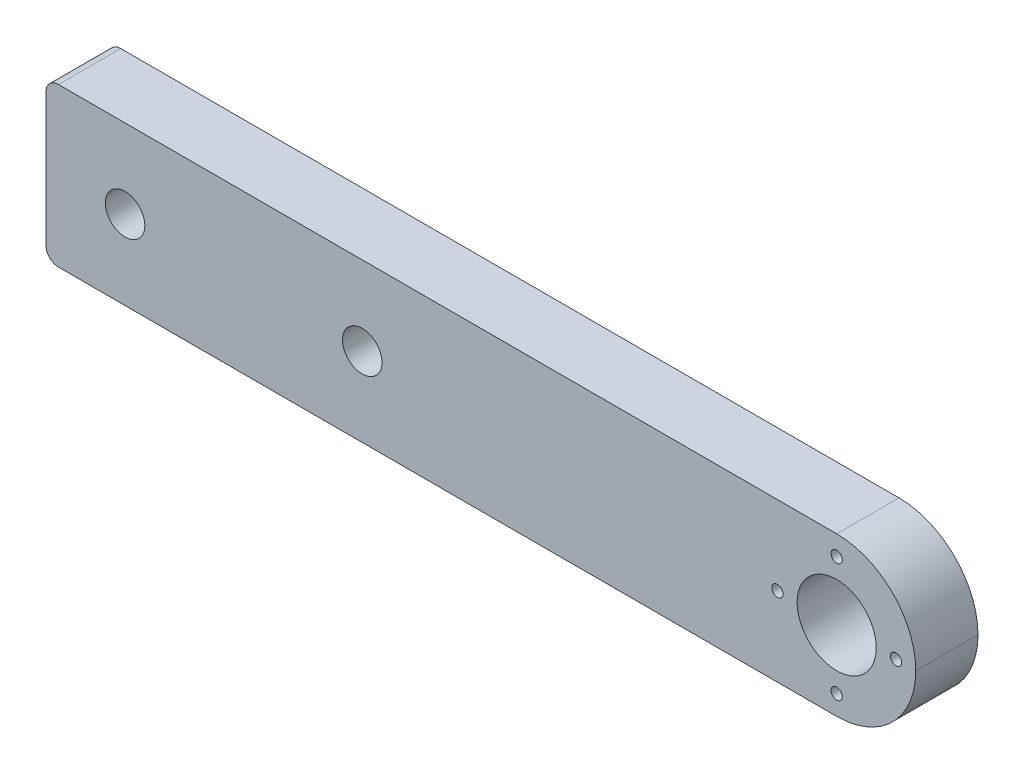
ISO-10303-21;
HEADER;
FILE_DESCRIPTION(('STEP AP214'),'2;1');
FILE_NAME('part.step','',(''),(''),'','','');
FILE_SCHEMA(('AUTOMOTIVE_DESIGN { 1 0 10303 214 1 1 1 1 }'));
ENDSEC;
DATA;
#1=APPLICATION_CONTEXT('core data for automotive mechanical design processes');
#2=APPLICATION_PROTOCOL_DEFINITION('international standard','automotive_design',2000,#1);
#3=PRODUCT_CONTEXT('',#1,'mechanical');
#4=PRODUCT('Part','Part','',(#3));
#5=PRODUCT_RELATED_PRODUCT_CATEGORY('part','',(#4));
#6=PRODUCT_DEFINITION_FORMATION('','',#4);
#7=PRODUCT_DEFINITION_CONTEXT('part definition',#1,'design');
#8=PRODUCT_DEFINITION('design','',#6,#7);
#9=PRODUCT_DEFINITION_SHAPE('','',#8);
#10=(LENGTH_UNIT() NAMED_UNIT(*) SI_UNIT(.MILLI.,.METRE.));
#11=(NAMED_UNIT(*) PLANE_ANGLE_UNIT() SI_UNIT($,.RADIAN.));
#12=(NAMED_UNIT(*) SI_UNIT($,.STERADIAN.) SOLID_ANGLE_UNIT());
#13=UNCERTAINTY_MEASURE_WITH_UNIT(LENGTH_MEASURE(1.E-05),#10,'distance_accuracy_value','');
#14=(GEOMETRIC_REPRESENTATION_CONTEXT(3) GLOBAL_UNCERTAINTY_ASSIGNED_CONTEXT((#13)) GLOBAL_UNIT_ASSIGNED_CONTEXT((#10,
#11,#12)) REPRESENTATION_CONTEXT('',''));
#15=CARTESIAN_POINT('',(0.,0.,0.));
#16=DIRECTION('',(0.,0.,1.));
#17=DIRECTION('',(1.,0.,0.));
#18=AXIS2_PLACEMENT_3D('',#15,#16,#17);
#19=CARTESIAN_POINT('',(0.,0.,10.));
#20=DIRECTION('',(0.,0.,-1.));
#21=DIRECTION('',(-1.,0.,0.));
#22=AXIS2_PLACEMENT_3D('',#19,#20,#21);
#23=PLANE('',#22);
#24=CARTESIAN_POINT('',(63.5,0.,10.));
#25=DIRECTION('',(0.,0.,-1.));
#26=DIRECTION('',(-1.,0.,0.));
#27=AXIS2_PLACEMENT_3D('',#24,#25,#26);
#28=CIRCLE('',#27,12.7);
#29=CARTESIAN_POINT('',(63.5,-12.7,10.));
#30=VERTEX_POINT('',#29);
#31=CARTESIAN_POINT('',(76.2,0.,10.));
#32=VERTEX_POINT('',#31);
#33=EDGE_CURVE('E49',#30,#32,#28,.F.);
#34=ORIENTED_EDGE('',*,*,#33,.T.);
#35=CARTESIAN_POINT('',(63.5,0.,10.));
#36=DIRECTION('',(0.,0.,-1.));
#37=DIRECTION('',(-1.,0.,0.));
#38=AXIS2_PLACEMENT_3D('',#35,#36,#37);
#39=CIRCLE('',#38,12.7);
#40=CARTESIAN_POINT('',(63.5,12.7,10.));
#41=VERTEX_POINT('',#40);
#42=EDGE_CURVE('E42',#32,#41,#39,.F.);
#43=ORIENTED_EDGE('',*,*,#42,.T.);
#44=DIRECTION('',(-1.,0.,0.));
#45=VECTOR('',#44,1.);
#46=CARTESIAN_POINT('',(76.2,12.7,10.));
#47=LINE('',#46,#45);
#48=CARTESIAN_POINT('',(-61.5,12.7,10.));
#49=VERTEX_POINT('',#48);
#50=EDGE_CURVE('E115',#41,#49,#47,.T.);
#51=ORIENTED_EDGE('',*,*,#50,.T.);
#52=CARTESIAN_POINT('',(-61.5,10.7,10.));
#53=DIRECTION('',(0.,0.,-1.));
#54=DIRECTION('',(-1.,0.,0.));
#55=AXIS2_PLACEMENT_3D('',#52,#53,#54);
#56=CIRCLE('',#55,2.);
#57=CARTESIAN_POINT('',(-63.5,10.7,10.));
#58=VERTEX_POINT('',#57);
#59=EDGE_CURVE('E129',#49,#58,#56,.F.);
#60=ORIENTED_EDGE('',*,*,#59,.T.);
#61=DIRECTION('',(0.,-1.,0.));
#62=VECTOR('',#61,1.);
#63=CARTESIAN_POINT('',(-63.5,-12.7,10.));
#64=LINE('',#63,#62);
#65=CARTESIAN_POINT('',(-63.5,-10.7,10.));
#66=VERTEX_POINT('',#65);
#67=EDGE_CURVE('E118',#58,#66,#64,.T.);
#68=ORIENTED_EDGE('',*,*,#67,.T.);
#69=CARTESIAN_POINT('',(-61.5,-10.7,10.));
#70=DIRECTION('',(0.,0.,-1.));
#71=DIRECTION('',(-1.,0.,0.));
#72=AXIS2_PLACEMENT_3D('',#69,#70,#71);
#73=CIRCLE('',#72,2.);
#74=CARTESIAN_POINT('',(-61.5,-12.7,10.));
#75=VERTEX_POINT('',#74);
#76=EDGE_CURVE('E131',#66,#75,#73,.F.);
#77=ORIENTED_EDGE('',*,*,#76,.T.);
#78=DIRECTION('',(1.,0.,0.));
#79=VECTOR('',#78,1.);
#80=CARTESIAN_POINT('',(63.5,-12.7,10.));
#81=LINE('',#80,#79);
#82=EDGE_CURVE('E108',#75,#30,#81,.T.);
#83=ORIENTED_EDGE('',*,*,#82,.T.);
#84=EDGE_LOOP('',(#34,#43,#51,#60,#68,#77,#83));
#85=FACE_BOUND('',#84,.T.);
#86=CARTESIAN_POINT('',(-50.8,0.,10.));
#87=DIRECTION('',(0.,0.,1.));
#88=DIRECTION('',(1.,0.,0.));
#89=AXIS2_PLACEMENT_3D('',#86,#87,#88);
#90=CIRCLE('',#89,3.175);
#91=CARTESIAN_POINT('',(-47.625,0.,10.));
#92=VERTEX_POINT('',#91);
#93=EDGE_CURVE('E195',#92,#92,#90,.T.);
#94=ORIENTED_EDGE('',*,*,#93,.F.);
#95=EDGE_LOOP('',(#94));
#96=FACE_BOUND('',#95,.T.);
#97=CARTESIAN_POINT('',(63.5,9.52500000000001,10.));
#98=DIRECTION('',(0.,0.,1.));
#99=DIRECTION('',(1.,0.,0.));
#100=AXIS2_PLACEMENT_3D('',#97,#98,#99);
#101=CIRCLE('',#100,0.900000000000004);
#102=CARTESIAN_POINT('',(64.4,9.52500000000001,10.));
#103=VERTEX_POINT('',#102);
#104=EDGE_CURVE('E189',#103,#103,#101,.T.);
#105=ORIENTED_EDGE('',*,*,#104,.F.);
#106=EDGE_LOOP('',(#105));
#107=FACE_BOUND('',#106,.T.);
#108=CARTESIAN_POINT('',(63.5,0.,10.));
#109=DIRECTION('',(0.,0.,1.));
#110=DIRECTION('',(1.,0.,0.));
#111=AXIS2_PLACEMENT_3D('',#108,#109,#110);
#112=CIRCLE('',#111,6.35);
#113=CARTESIAN_POINT('',(69.85,0.,10.));
#114=VERTEX_POINT('',#113);
#115=EDGE_CURVE('E183',#114,#114,#112,.T.);
#116=ORIENTED_EDGE('',*,*,#115,.F.);
#117=EDGE_LOOP('',(#116));
#118=FACE_BOUND('',#117,.T.);
#119=CARTESIAN_POINT('',(63.5,-9.52499999999999,10.));
#120=DIRECTION('',(0.,0.,1.));
#121=DIRECTION('',(1.,0.,0.));
#122=AXIS2_PLACEMENT_3D('',#119,#120,#121);
#123=CIRCLE('',#122,0.900000000000004);
#124=CARTESIAN_POINT('',(64.4,-9.52499999999999,10.));
#125=VERTEX_POINT('',#124);
#126=EDGE_CURVE('E177',#125,#125,#123,.T.);
#127=ORIENTED_EDGE('',*,*,#126,.F.);
#128=EDGE_LOOP('',(#127));
#129=FACE_BOUND('',#128,.T.);
#130=CARTESIAN_POINT('',(53.975,0.,10.));
#131=DIRECTION('',(0.,0.,1.));
#132=DIRECTION('',(1.,0.,0.));
#133=AXIS2_PLACEMENT_3D('',#130,#131,#132);
#134=CIRCLE('',#133,0.900000000000004);
#135=CARTESIAN_POINT('',(54.875,0.,10.));
#136=VERTEX_POINT('',#135);
#137=EDGE_CURVE('E171',#136,#136,#134,.T.);
#138=ORIENTED_EDGE('',*,*,#137,.F.);
#139=EDGE_LOOP('',(#138));
#140=FACE_BOUND('',#139,.T.);
#141=CARTESIAN_POINT('',(73.025,0.,10.));
#142=DIRECTION('',(0.,0.,1.));
#143=DIRECTION('',(1.,0.,0.));
#144=AXIS2_PLACEMENT_3D('',#141,#142,#143);
#145=CIRCLE('',#144,0.900000000000003);
#146=CARTESIAN_POINT('',(73.925,0.,10.));
#147=VERTEX_POINT('',#146);
#148=EDGE_CURVE('E165',#147,#147,#145,.T.);
#149=ORIENTED_EDGE('',*,*,#148,.F.);
#150=EDGE_LOOP('',(#149));
#151=FACE_BOUND('',#150,.T.);
#152=CARTESIAN_POINT('',(-12.7,0.,10.));
#153=DIRECTION('',(0.,0.,1.));
#154=DIRECTION('',(1.,0.,0.));
#155=AXIS2_PLACEMENT_3D('',#152,#153,#154);
#156=CIRCLE('',#155,3.175);
#157=CARTESIAN_POINT('',(-9.52499999999998,0.,10.));
#158=VERTEX_POINT('',#157);
#159=EDGE_CURVE('E157',#158,#158,#156,.T.);
#160=ORIENTED_EDGE('',*,*,#159,.F.);
#161=EDGE_LOOP('',(#160));
#162=FACE_BOUND('',#161,.T.);
#163=ADVANCED_FACE('F33',(#85,#96,#107,#118,#129,#140,#151,#162),#23,.F.);
#164=CARTESIAN_POINT('',(0.,0.,0.));
#165=DIRECTION('',(0.,0.,-1.));
#166=DIRECTION('',(-1.,0.,0.));
#167=AXIS2_PLACEMENT_3D('',#164,#165,#166);
#168=PLANE('',#167);
#169=CARTESIAN_POINT('',(73.025,0.,0.));
#170=DIRECTION('',(0.,0.,1.));
#171=DIRECTION('',(1.,0.,0.));
#172=AXIS2_PLACEMENT_3D('',#169,#170,#171);
#173=CIRCLE('',#172,0.900000000000003);
#174=CARTESIAN_POINT('',(73.925,0.,0.));
#175=VERTEX_POINT('',#174);
#176=EDGE_CURVE('E162',#175,#175,#173,.T.);
#177=ORIENTED_EDGE('',*,*,#176,.T.);
#178=EDGE_LOOP('',(#177));
#179=FACE_BOUND('',#178,.T.);
#180=CARTESIAN_POINT('',(63.5,-9.52499999999999,0.));
#181=DIRECTION('',(0.,0.,1.));
#182=DIRECTION('',(1.,0.,0.));
#183=AXIS2_PLACEMENT_3D('',#180,#181,#182);
#184=CIRCLE('',#183,0.900000000000004);
#185=CARTESIAN_POINT('',(64.4,-9.52499999999999,0.));
#186=VERTEX_POINT('',#185);
#187=EDGE_CURVE('E174',#186,#186,#184,.T.);
#188=ORIENTED_EDGE('',*,*,#187,.T.);
#189=EDGE_LOOP('',(#188));
#190=FACE_BOUND('',#189,.T.);
#191=CARTESIAN_POINT('',(63.5,9.52500000000001,0.));
#192=DIRECTION('',(0.,0.,1.));
#193=DIRECTION('',(1.,0.,0.));
#194=AXIS2_PLACEMENT_3D('',#191,#192,#193);
#195=CIRCLE('',#194,0.900000000000004);
#196=CARTESIAN_POINT('',(64.4,9.52500000000001,0.));
#197=VERTEX_POINT('',#196);
#198=EDGE_CURVE('E186',#197,#197,#195,.T.);
#199=ORIENTED_EDGE('',*,*,#198,.T.);
#200=EDGE_LOOP('',(#199));
#201=FACE_BOUND('',#200,.T.);
#202=DIRECTION('',(-1.,0.,0.));
#203=VECTOR('',#202,1.);
#204=CARTESIAN_POINT('',(63.5,12.7,0.));
#205=LINE('',#204,#203);
#206=CARTESIAN_POINT('',(63.5,12.7,0.));
#207=VERTEX_POINT('',#206);
#208=CARTESIAN_POINT('',(-61.5,12.7,0.));
#209=VERTEX_POINT('',#208);
#210=EDGE_CURVE('E120',#207,#209,#205,.T.);
#211=ORIENTED_EDGE('',*,*,#210,.F.);
#212=CARTESIAN_POINT('',(63.5,0.,0.));
#213=DIRECTION('',(0.,0.,-1.));
#214=DIRECTION('',(-1.,0.,0.));
#215=AXIS2_PLACEMENT_3D('',#212,#213,#214);
#216=CIRCLE('',#215,12.7);
#217=CARTESIAN_POINT('',(76.2,0.,0.));
#218=VERTEX_POINT('',#217);
#219=EDGE_CURVE('E140',#207,#218,#216,.T.);
#220=ORIENTED_EDGE('',*,*,#219,.T.);
#221=CARTESIAN_POINT('',(63.5,0.,0.));
#222=DIRECTION('',(0.,0.,-1.));
#223=DIRECTION('',(-1.,0.,0.));
#224=AXIS2_PLACEMENT_3D('',#221,#222,#223);
#225=CIRCLE('',#224,12.7);
#226=CARTESIAN_POINT('',(63.5,-12.7,0.));
#227=VERTEX_POINT('',#226);
#228=EDGE_CURVE('E114',#218,#227,#225,.T.);
#229=ORIENTED_EDGE('',*,*,#228,.T.);
#230=DIRECTION('',(1.,0.,0.));
#231=VECTOR('',#230,1.);
#232=CARTESIAN_POINT('',(63.5,-12.7,0.));
#233=LINE('',#232,#231);
#234=CARTESIAN_POINT('',(-61.5,-12.7,0.));
#235=VERTEX_POINT('',#234);
#236=EDGE_CURVE('E107',#235,#227,#233,.T.);
#237=ORIENTED_EDGE('',*,*,#236,.F.);
#238=CARTESIAN_POINT('',(-61.5,-10.7,0.));
#239=DIRECTION('',(0.,0.,-1.));
#240=DIRECTION('',(-1.,0.,0.));
#241=AXIS2_PLACEMENT_3D('',#238,#239,#240);
#242=CIRCLE('',#241,2.);
#243=CARTESIAN_POINT('',(-63.5,-10.7,0.));
#244=VERTEX_POINT('',#243);
#245=EDGE_CURVE('E93',#235,#244,#242,.T.);
#246=ORIENTED_EDGE('',*,*,#245,.T.);
#247=DIRECTION('',(0.,-1.,0.));
#248=VECTOR('',#247,1.);
#249=CARTESIAN_POINT('',(-63.5,-12.7,0.));
#250=LINE('',#249,#248);
#251=CARTESIAN_POINT('',(-63.5,10.7,0.));
#252=VERTEX_POINT('',#251);
#253=EDGE_CURVE('E116',#252,#244,#250,.T.);
#254=ORIENTED_EDGE('',*,*,#253,.F.);
#255=CARTESIAN_POINT('',(-61.5,10.7,0.));
#256=DIRECTION('',(0.,0.,-1.));
#257=DIRECTION('',(-1.,0.,0.));
#258=AXIS2_PLACEMENT_3D('',#255,#256,#257);
#259=CIRCLE('',#258,2.);
#260=EDGE_CURVE('E104',#252,#209,#259,.T.);
#261=ORIENTED_EDGE('',*,*,#260,.T.);
#262=EDGE_LOOP('',(#211,#220,#229,#237,#246,#254,#261));
#263=FACE_BOUND('',#262,.T.);
#264=CARTESIAN_POINT('',(-50.8,0.,0.));
#265=DIRECTION('',(0.,0.,1.));
#266=DIRECTION('',(1.,0.,0.));
#267=AXIS2_PLACEMENT_3D('',#264,#265,#266);
#268=CIRCLE('',#267,3.175);
#269=CARTESIAN_POINT('',(-47.625,0.,0.));
#270=VERTEX_POINT('',#269);
#271=EDGE_CURVE('E192',#270,#270,#268,.T.);
#272=ORIENTED_EDGE('',*,*,#271,.T.);
#273=EDGE_LOOP('',(#272));
#274=FACE_BOUND('',#273,.T.);
#275=CARTESIAN_POINT('',(63.5,0.,0.));
#276=DIRECTION('',(0.,0.,1.));
#277=DIRECTION('',(1.,0.,0.));
#278=AXIS2_PLACEMENT_3D('',#275,#276,#277);
#279=CIRCLE('',#278,6.35);
#280=CARTESIAN_POINT('',(69.85,0.,0.));
#281=VERTEX_POINT('',#280);
#282=EDGE_CURVE('E180',#281,#281,#279,.T.);
#283=ORIENTED_EDGE('',*,*,#282,.T.);
#284=EDGE_LOOP('',(#283));
#285=FACE_BOUND('',#284,.T.);
#286=CARTESIAN_POINT('',(53.975,0.,0.));
#287=DIRECTION('',(0.,0.,1.));
#288=DIRECTION('',(1.,0.,0.));
#289=AXIS2_PLACEMENT_3D('',#286,#287,#288);
#290=CIRCLE('',#289,0.900000000000004);
#291=CARTESIAN_POINT('',(54.875,0.,0.));
#292=VERTEX_POINT('',#291);
#293=EDGE_CURVE('E168',#292,#292,#290,.T.);
#294=ORIENTED_EDGE('',*,*,#293,.T.);
#295=EDGE_LOOP('',(#294));
#296=FACE_BOUND('',#295,.T.);
#297=CARTESIAN_POINT('',(-12.7,0.,0.));
#298=DIRECTION('',(0.,0.,1.));
#299=DIRECTION('',(1.,0.,0.));
#300=AXIS2_PLACEMENT_3D('',#297,#298,#299);
#301=CIRCLE('',#300,3.175);
#302=CARTESIAN_POINT('',(-9.52499999999998,0.,0.));
#303=VERTEX_POINT('',#302);
#304=EDGE_CURVE('E155',#303,#303,#301,.T.);
#305=ORIENTED_EDGE('',*,*,#304,.T.);
#306=EDGE_LOOP('',(#305));
#307=FACE_BOUND('',#306,.T.);
#308=ADVANCED_FACE('F111',(#179,#190,#201,#263,#274,#285,#296,#307),#168,.T.);
#309=CARTESIAN_POINT('',(63.5,12.7,10.));
#310=DIRECTION('',(0.,-1.,0.));
#311=DIRECTION('',(1.,0.,0.));
#312=AXIS2_PLACEMENT_3D('',#309,#310,#311);
#313=PLANE('',#312);
#314=ORIENTED_EDGE('',*,*,#50,.F.);
#315=DIRECTION('',(0.,0.,-1.));
#316=VECTOR('',#315,1.);
#317=CARTESIAN_POINT('',(63.5,12.7,10.));
#318=LINE('',#317,#316);
#319=EDGE_CURVE('E136',#41,#207,#318,.T.);
#320=ORIENTED_EDGE('',*,*,#319,.T.);
#321=ORIENTED_EDGE('',*,*,#210,.T.);
#322=DIRECTION('',(0.,0.,-1.));
#323=VECTOR('',#322,1.);
#324=CARTESIAN_POINT('',(-61.5,12.7,10.));
#325=LINE('',#324,#323);
#326=EDGE_CURVE('E133',#209,#49,#325,.F.);
#327=ORIENTED_EDGE('',*,*,#326,.T.);
#328=EDGE_LOOP('',(#314,#320,#321,#327));
#329=FACE_BOUND('',#328,.T.);
#330=ADVANCED_FACE('F150',(#329),#313,.F.);
#331=CARTESIAN_POINT('',(-63.5,-12.7,10.));
#332=DIRECTION('',(1.,0.,0.));
#333=DIRECTION('',(0.,0.,-1.));
#334=AXIS2_PLACEMENT_3D('',#331,#332,#333);
#335=PLANE('',#334);
#336=ORIENTED_EDGE('',*,*,#253,.T.);
#337=DIRECTION('',(0.,0.,-1.));
#338=VECTOR('',#337,1.);
#339=CARTESIAN_POINT('',(-63.5,-10.7,10.));
#340=LINE('',#339,#338);
#341=EDGE_CURVE('E98',#244,#66,#340,.F.);
#342=ORIENTED_EDGE('',*,*,#341,.T.);
#343=ORIENTED_EDGE('',*,*,#67,.F.);
#344=DIRECTION('',(0.,0.,-1.));
#345=VECTOR('',#344,1.);
#346=CARTESIAN_POINT('',(-63.5,10.7,10.));
#347=LINE('',#346,#345);
#348=EDGE_CURVE('E103',#58,#252,#347,.T.);
#349=ORIENTED_EDGE('',*,*,#348,.T.);
#350=EDGE_LOOP('',(#336,#342,#343,#349));
#351=FACE_BOUND('',#350,.T.);
#352=ADVANCED_FACE('F207',(#351),#335,.F.);
#353=CARTESIAN_POINT('',(63.5,-12.7,10.));
#354=DIRECTION('',(0.,1.,0.));
#355=DIRECTION('',(-1.,0.,0.));
#356=AXIS2_PLACEMENT_3D('',#353,#354,#355);
#357=PLANE('',#356);
#358=ORIENTED_EDGE('',*,*,#236,.T.);
#359=DIRECTION('',(0.,0.,-1.));
#360=VECTOR('',#359,1.);
#361=CARTESIAN_POINT('',(63.5,-12.7,10.));
#362=LINE('',#361,#360);
#363=EDGE_CURVE('E11',#227,#30,#362,.F.);
#364=ORIENTED_EDGE('',*,*,#363,.T.);
#365=ORIENTED_EDGE('',*,*,#82,.F.);
#366=DIRECTION('',(0.,0.,-1.));
#367=VECTOR('',#366,1.);
#368=CARTESIAN_POINT('',(-61.5,-12.7,10.));
#369=LINE('',#368,#367);
#370=EDGE_CURVE('E97',#75,#235,#369,.T.);
#371=ORIENTED_EDGE('',*,*,#370,.T.);
#372=EDGE_LOOP('',(#358,#364,#365,#371));
#373=FACE_BOUND('',#372,.T.);
#374=ADVANCED_FACE('F106',(#373),#357,.F.);
#375=CARTESIAN_POINT('',(-50.8,0.,10.));
#376=DIRECTION('',(0.,0.,-1.));
#377=DIRECTION('',(-1.,0.,0.));
#378=AXIS2_PLACEMENT_3D('',#375,#376,#377);
#379=CYLINDRICAL_SURFACE('',#378,3.175);
#380=ORIENTED_EDGE('',*,*,#93,.T.);
#381=EDGE_LOOP('',(#380));
#382=FACE_BOUND('',#381,.T.);
#383=ORIENTED_EDGE('',*,*,#271,.F.);
#384=EDGE_LOOP('',(#383));
#385=FACE_BOUND('',#384,.T.);
#386=ADVANCED_FACE('F214',(#382,#385),#379,.F.);
#387=CARTESIAN_POINT('',(63.5,9.52500000000001,10.));
#388=DIRECTION('',(0.,0.,-1.));
#389=DIRECTION('',(-1.,0.,0.));
#390=AXIS2_PLACEMENT_3D('',#387,#388,#389);
#391=CYLINDRICAL_SURFACE('',#390,0.900000000000004);
#392=ORIENTED_EDGE('',*,*,#104,.T.);
#393=EDGE_LOOP('',(#392));
#394=FACE_BOUND('',#393,.T.);
#395=ORIENTED_EDGE('',*,*,#198,.F.);
#396=EDGE_LOOP('',(#395));
#397=FACE_BOUND('',#396,.T.);
#398=ADVANCED_FACE('F227',(#394,#397),#391,.F.);
#399=CARTESIAN_POINT('',(63.5,0.,10.));
#400=DIRECTION('',(0.,0.,-1.));
#401=DIRECTION('',(-1.,0.,0.));
#402=AXIS2_PLACEMENT_3D('',#399,#400,#401);
#403=CYLINDRICAL_SURFACE('',#402,6.35);
#404=ORIENTED_EDGE('',*,*,#115,.T.);
#405=EDGE_LOOP('',(#404));
#406=FACE_BOUND('',#405,.T.);
#407=ORIENTED_EDGE('',*,*,#282,.F.);
#408=EDGE_LOOP('',(#407));
#409=FACE_BOUND('',#408,.T.);
#410=ADVANCED_FACE('F231',(#406,#409),#403,.F.);
#411=CARTESIAN_POINT('',(63.5,-9.52499999999999,10.));
#412=DIRECTION('',(0.,0.,-1.));
#413=DIRECTION('',(-1.,0.,0.));
#414=AXIS2_PLACEMENT_3D('',#411,#412,#413);
#415=CYLINDRICAL_SURFACE('',#414,0.900000000000004);
#416=ORIENTED_EDGE('',*,*,#126,.T.);
#417=EDGE_LOOP('',(#416));
#418=FACE_BOUND('',#417,.T.);
#419=ORIENTED_EDGE('',*,*,#187,.F.);
#420=EDGE_LOOP('',(#419));
#421=FACE_BOUND('',#420,.T.);
#422=ADVANCED_FACE('F235',(#418,#421),#415,.F.);
#423=CARTESIAN_POINT('',(53.975,0.,10.));
#424=DIRECTION('',(0.,0.,-1.));
#425=DIRECTION('',(-1.,0.,0.));
#426=AXIS2_PLACEMENT_3D('',#423,#424,#425);
#427=CYLINDRICAL_SURFACE('',#426,0.900000000000004);
#428=ORIENTED_EDGE('',*,*,#137,.T.);
#429=EDGE_LOOP('',(#428));
#430=FACE_BOUND('',#429,.T.);
#431=ORIENTED_EDGE('',*,*,#293,.F.);
#432=EDGE_LOOP('',(#431));
#433=FACE_BOUND('',#432,.T.);
#434=ADVANCED_FACE('F239',(#430,#433),#427,.F.);
#435=CARTESIAN_POINT('',(73.025,0.,10.));
#436=DIRECTION('',(0.,0.,-1.));
#437=DIRECTION('',(-1.,0.,0.));
#438=AXIS2_PLACEMENT_3D('',#435,#436,#437);
#439=CYLINDRICAL_SURFACE('',#438,0.900000000000003);
#440=ORIENTED_EDGE('',*,*,#148,.T.);
#441=EDGE_LOOP('',(#440));
#442=FACE_BOUND('',#441,.T.);
#443=ORIENTED_EDGE('',*,*,#176,.F.);
#444=EDGE_LOOP('',(#443));
#445=FACE_BOUND('',#444,.T.);
#446=ADVANCED_FACE('F243',(#442,#445),#439,.F.);
#447=CARTESIAN_POINT('',(-12.7,0.,10.));
#448=DIRECTION('',(0.,0.,-1.));
#449=DIRECTION('',(-1.,0.,0.));
#450=AXIS2_PLACEMENT_3D('',#447,#448,#449);
#451=CYLINDRICAL_SURFACE('',#450,3.175);
#452=ORIENTED_EDGE('',*,*,#159,.T.);
#453=EDGE_LOOP('',(#452));
#454=FACE_BOUND('',#453,.T.);
#455=ORIENTED_EDGE('',*,*,#304,.F.);
#456=EDGE_LOOP('',(#455));
#457=FACE_BOUND('',#456,.T.);
#458=ADVANCED_FACE('F247',(#454,#457),#451,.F.);
#459=CARTESIAN_POINT('',(-61.5,-10.7,10.));
#460=DIRECTION('',(0.,0.,-1.));
#461=DIRECTION('',(-1.,0.,0.));
#462=AXIS2_PLACEMENT_3D('',#459,#460,#461);
#463=CYLINDRICAL_SURFACE('',#462,2.);
#464=ORIENTED_EDGE('',*,*,#76,.F.);
#465=ORIENTED_EDGE('',*,*,#341,.F.);
#466=ORIENTED_EDGE('',*,*,#245,.F.);
#467=ORIENTED_EDGE('',*,*,#370,.F.);
#468=EDGE_LOOP('',(#464,#465,#466,#467));
#469=FACE_BOUND('',#468,.T.);
#470=ADVANCED_FACE('F96',(#469),#463,.T.);
#471=CARTESIAN_POINT('',(-61.5,10.7,10.));
#472=DIRECTION('',(0.,0.,-1.));
#473=DIRECTION('',(-1.,0.,0.));
#474=AXIS2_PLACEMENT_3D('',#471,#472,#473);
#475=CYLINDRICAL_SURFACE('',#474,2.);
#476=ORIENTED_EDGE('',*,*,#59,.F.);
#477=ORIENTED_EDGE('',*,*,#326,.F.);
#478=ORIENTED_EDGE('',*,*,#260,.F.);
#479=ORIENTED_EDGE('',*,*,#348,.F.);
#480=EDGE_LOOP('',(#476,#477,#478,#479));
#481=FACE_BOUND('',#480,.T.);
#482=ADVANCED_FACE('F204',(#481),#475,.T.);
#483=CARTESIAN_POINT('',(63.5,0.,10.));
#484=DIRECTION('',(0.,0.,-1.));
#485=DIRECTION('',(-1.,0.,0.));
#486=AXIS2_PLACEMENT_3D('',#483,#484,#485);
#487=CYLINDRICAL_SURFACE('',#486,12.7);
#488=DIRECTION('',(0.,0.,-1.));
#489=VECTOR('',#488,1.);
#490=CARTESIAN_POINT('',(76.2,0.,10.));
#491=LINE('',#490,#489);
#492=EDGE_CURVE('E37',#32,#218,#491,.T.);
#493=ORIENTED_EDGE('',*,*,#492,.F.);
#494=ORIENTED_EDGE('',*,*,#33,.F.);
#495=ORIENTED_EDGE('',*,*,#363,.F.);
#496=ORIENTED_EDGE('',*,*,#228,.F.);
#497=EDGE_LOOP('',(#493,#494,#495,#496));
#498=FACE_BOUND('',#497,.T.);
#499=ADVANCED_FACE('F35',(#498),#487,.T.);
#500=CARTESIAN_POINT('',(63.5,0.,10.));
#501=DIRECTION('',(0.,0.,-1.));
#502=DIRECTION('',(-1.,0.,0.));
#503=AXIS2_PLACEMENT_3D('',#500,#501,#502);
#504=CYLINDRICAL_SURFACE('',#503,12.7);
#505=ORIENTED_EDGE('',*,*,#42,.F.);
#506=ORIENTED_EDGE('',*,*,#492,.T.);
#507=ORIENTED_EDGE('',*,*,#219,.F.);
#508=ORIENTED_EDGE('',*,*,#319,.F.);
#509=EDGE_LOOP('',(#505,#506,#507,#508));
#510=FACE_BOUND('',#509,.T.);
#511=ADVANCED_FACE('F153',(#510),#504,.T.);
#512=CLOSED_SHELL('',(#163,#308,#330,#352,#374,#386,#398,#410,#422,#434,#446,#458,#470,#482,
#499,#511));
#513=MANIFOLD_SOLID_BREP('B2',#512);
#514=ADVANCED_BREP_SHAPE_REPRESENTATION('',(#18,#513),#14);
#515=SHAPE_DEFINITION_REPRESENTATION(#9,#514);
ENDSEC;
END-ISO-10303-21;
